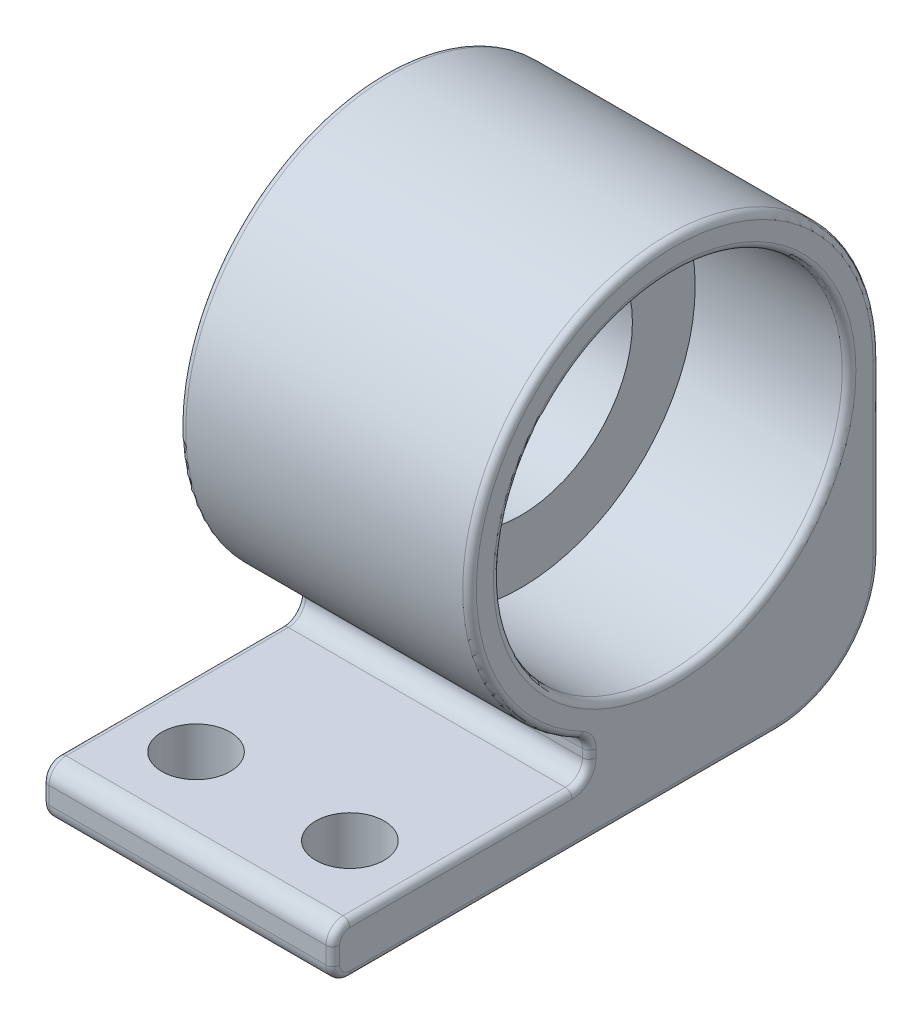
ISO-10303-21;
HEADER;
FILE_DESCRIPTION(('STEP AP214'),'2;1');
FILE_NAME('part.step','',(''),(''),'','','');
FILE_SCHEMA(('AUTOMOTIVE_DESIGN { 1 0 10303 214 1 1 1 1 }'));
ENDSEC;
DATA;
#1=APPLICATION_CONTEXT('core data for automotive mechanical design processes');
#2=APPLICATION_PROTOCOL_DEFINITION('international standard','automotive_design',2000,#1);
#3=PRODUCT_CONTEXT('',#1,'mechanical');
#4=PRODUCT('Part','Part','',(#3));
#5=PRODUCT_RELATED_PRODUCT_CATEGORY('part','',(#4));
#6=PRODUCT_DEFINITION_FORMATION('','',#4);
#7=PRODUCT_DEFINITION_CONTEXT('part definition',#1,'design');
#8=PRODUCT_DEFINITION('design','',#6,#7);
#9=PRODUCT_DEFINITION_SHAPE('','',#8);
#10=(LENGTH_UNIT() NAMED_UNIT(*) SI_UNIT(.MILLI.,.METRE.));
#11=(NAMED_UNIT(*) PLANE_ANGLE_UNIT() SI_UNIT($,.RADIAN.));
#12=(NAMED_UNIT(*) SI_UNIT($,.STERADIAN.) SOLID_ANGLE_UNIT());
#13=UNCERTAINTY_MEASURE_WITH_UNIT(LENGTH_MEASURE(1.E-05),#10,'distance_accuracy_value','');
#14=(GEOMETRIC_REPRESENTATION_CONTEXT(3) GLOBAL_UNCERTAINTY_ASSIGNED_CONTEXT((#13)) GLOBAL_UNIT_ASSIGNED_CONTEXT((#10,
#11,#12)) REPRESENTATION_CONTEXT('',''));
#15=CARTESIAN_POINT('',(0.,0.,0.));
#16=DIRECTION('',(0.,0.,1.));
#17=DIRECTION('',(1.,0.,0.));
#18=AXIS2_PLACEMENT_3D('',#15,#16,#17);
#19=CARTESIAN_POINT('',(8.5,0.,0.));
#20=DIRECTION('',(-1.,0.,0.));
#21=DIRECTION('',(0.,0.,1.));
#22=AXIS2_PLACEMENT_3D('',#19,#20,#21);
#23=CYLINDRICAL_SURFACE('',#22,6.);
#24=DIRECTION('',(-1.,0.,0.));
#25=VECTOR('',#24,1.);
#26=CARTESIAN_POINT('',(8.5,0.,-6.));
#27=LINE('',#26,#25);
#28=CARTESIAN_POINT('',(8.3,0.,-6.));
#29=VERTEX_POINT('',#28);
#30=CARTESIAN_POINT('',(0.200000000000001,0.,-6.));
#31=VERTEX_POINT('',#30);
#32=EDGE_CURVE('E418',#29,#31,#27,.T.);
#33=ORIENTED_EDGE('',*,*,#32,.T.);
#34=CARTESIAN_POINT('',(0.200000000000001,0.,0.));
#35=DIRECTION('',(1.,0.,0.));
#36=DIRECTION('',(0.,0.,-1.));
#37=AXIS2_PLACEMENT_3D('',#34,#35,#36);
#38=CIRCLE('',#37,6.);
#39=CARTESIAN_POINT('',(0.200000000000001,-5.32272119754037,2.76923076923077));
#40=VERTEX_POINT('',#39);
#41=EDGE_CURVE('E294',#31,#40,#38,.T.);
#42=ORIENTED_EDGE('',*,*,#41,.T.);
#43=DIRECTION('',(-1.,0.,0.));
#44=VECTOR('',#43,1.);
#45=CARTESIAN_POINT('',(8.5,-5.32272119754037,2.76923076923077));
#46=LINE('',#45,#44);
#47=CARTESIAN_POINT('',(8.3,-5.32272119754037,2.76923076923077));
#48=VERTEX_POINT('',#47);
#49=EDGE_CURVE('E210',#48,#40,#46,.T.);
#50=ORIENTED_EDGE('',*,*,#49,.F.);
#51=CARTESIAN_POINT('',(8.3,0.,0.));
#52=DIRECTION('',(1.,0.,0.));
#53=DIRECTION('',(0.,0.,-1.));
#54=AXIS2_PLACEMENT_3D('',#51,#52,#53);
#55=CIRCLE('',#54,6.);
#56=EDGE_CURVE('E292',#48,#29,#55,.F.);
#57=ORIENTED_EDGE('',*,*,#56,.T.);
#58=EDGE_LOOP('',(#33,#42,#50,#57));
#59=FACE_BOUND('',#58,.T.);
#60=ADVANCED_FACE('F36',(#59),#23,.T.);
#61=CARTESIAN_POINT('',(8.5,-5.7662812973354,3.));
#62=DIRECTION('',(-1.,0.,0.));
#63=DIRECTION('',(0.,0.,1.));
#64=AXIS2_PLACEMENT_3D('',#61,#62,#63);
#65=CYLINDRICAL_SURFACE('',#64,0.5);
#66=ORIENTED_EDGE('',*,*,#49,.T.);
#67=CARTESIAN_POINT('',(0.200000000000001,-5.7662812973354,3.));
#68=DIRECTION('',(1.,0.,0.));
#69=DIRECTION('',(0.,0.,-1.));
#70=AXIS2_PLACEMENT_3D('',#67,#68,#69);
#71=CIRCLE('',#70,0.5);
#72=CARTESIAN_POINT('',(0.200000000000001,-5.7662812973354,2.5));
#73=VERTEX_POINT('',#72);
#74=EDGE_CURVE('E209',#40,#73,#71,.F.);
#75=ORIENTED_EDGE('',*,*,#74,.T.);
#76=DIRECTION('',(-1.,0.,0.));
#77=VECTOR('',#76,1.);
#78=CARTESIAN_POINT('',(8.5,-5.7662812973354,2.5));
#79=LINE('',#78,#77);
#80=CARTESIAN_POINT('',(8.3,-5.7662812973354,2.5));
#81=VERTEX_POINT('',#80);
#82=EDGE_CURVE('E191',#81,#73,#79,.T.);
#83=ORIENTED_EDGE('',*,*,#82,.F.);
#84=CARTESIAN_POINT('',(8.3,-5.7662812973354,3.));
#85=DIRECTION('',(1.,0.,0.));
#86=DIRECTION('',(0.,0.,-1.));
#87=AXIS2_PLACEMENT_3D('',#84,#85,#86);
#88=CIRCLE('',#87,0.5);
#89=EDGE_CURVE('E206',#81,#48,#88,.T.);
#90=ORIENTED_EDGE('',*,*,#89,.T.);
#91=EDGE_LOOP('',(#66,#75,#83,#90));
#92=FACE_BOUND('',#91,.T.);
#93=ADVANCED_FACE('F204',(#92),#65,.F.);
#94=CARTESIAN_POINT('',(8.5,-5.7662812973354,2.5));
#95=DIRECTION('',(0.,0.,-1.));
#96=DIRECTION('',(-1.,0.,0.));
#97=AXIS2_PLACEMENT_3D('',#94,#95,#96);
#98=PLANE('',#97);
#99=ORIENTED_EDGE('',*,*,#82,.T.);
#100=DIRECTION('',(0.,-1.,0.));
#101=VECTOR('',#100,1.);
#102=CARTESIAN_POINT('',(0.200000000000001,-5.7662812973354,2.5));
#103=LINE('',#102,#101);
#104=CARTESIAN_POINT('',(0.200000000000001,-5.99999999999999,2.5));
#105=VERTEX_POINT('',#104);
#106=EDGE_CURVE('E198',#73,#105,#103,.T.);
#107=ORIENTED_EDGE('',*,*,#106,.T.);
#108=DIRECTION('',(-1.,0.,0.));
#109=VECTOR('',#108,1.);
#110=CARTESIAN_POINT('',(8.5,-5.99999999999999,2.5));
#111=LINE('',#110,#109);
#112=CARTESIAN_POINT('',(8.3,-5.99999999999999,2.5));
#113=VERTEX_POINT('',#112);
#114=EDGE_CURVE('E193',#113,#105,#111,.T.);
#115=ORIENTED_EDGE('',*,*,#114,.F.);
#116=DIRECTION('',(0.,-1.,0.));
#117=VECTOR('',#116,1.);
#118=CARTESIAN_POINT('',(8.3,-5.7662812973354,2.5));
#119=LINE('',#118,#117);
#120=EDGE_CURVE('E188',#113,#81,#119,.F.);
#121=ORIENTED_EDGE('',*,*,#120,.T.);
#122=EDGE_LOOP('',(#99,#107,#115,#121));
#123=FACE_BOUND('',#122,.T.);
#124=ADVANCED_FACE('F190',(#123),#98,.F.);
#125=CARTESIAN_POINT('',(8.5,-6.,3.));
#126=DIRECTION('',(-1.,0.,0.));
#127=DIRECTION('',(0.,0.,1.));
#128=AXIS2_PLACEMENT_3D('',#125,#126,#127);
#129=CYLINDRICAL_SURFACE('',#128,0.5);
#130=ORIENTED_EDGE('',*,*,#114,.T.);
#131=CARTESIAN_POINT('',(0.200000000000001,-6.,3.));
#132=DIRECTION('',(1.,0.,0.));
#133=DIRECTION('',(0.,0.,-1.));
#134=AXIS2_PLACEMENT_3D('',#131,#132,#133);
#135=CIRCLE('',#134,0.5);
#136=CARTESIAN_POINT('',(0.200000000000001,-6.5,3.));
#137=VERTEX_POINT('',#136);
#138=EDGE_CURVE('E261',#105,#137,#135,.F.);
#139=ORIENTED_EDGE('',*,*,#138,.T.);
#140=DIRECTION('',(-1.,0.,0.));
#141=VECTOR('',#140,1.);
#142=CARTESIAN_POINT('',(8.5,-6.5,3.));
#143=LINE('',#142,#141);
#144=CARTESIAN_POINT('',(8.3,-6.5,3.));
#145=VERTEX_POINT('',#144);
#146=EDGE_CURVE('E394',#145,#137,#143,.T.);
#147=ORIENTED_EDGE('',*,*,#146,.F.);
#148=CARTESIAN_POINT('',(8.3,-6.,3.));
#149=DIRECTION('',(1.,0.,0.));
#150=DIRECTION('',(0.,0.,-1.));
#151=AXIS2_PLACEMENT_3D('',#148,#149,#150);
#152=CIRCLE('',#151,0.5);
#153=EDGE_CURVE('E259',#145,#113,#152,.T.);
#154=ORIENTED_EDGE('',*,*,#153,.T.);
#155=EDGE_LOOP('',(#130,#139,#147,#154));
#156=FACE_BOUND('',#155,.T.);
#157=ADVANCED_FACE('F391',(#156),#129,.F.);
#158=CARTESIAN_POINT('',(8.5,-6.5,9.5));
#159=DIRECTION('',(0.,-1.,0.));
#160=DIRECTION('',(0.,0.,-1.));
#161=AXIS2_PLACEMENT_3D('',#158,#159,#160);
#162=PLANE('',#161);
#163=CARTESIAN_POINT('',(6.5,-6.5,7.5));
#164=DIRECTION('',(0.,1.,0.));
#165=DIRECTION('',(0.,0.,1.));
#166=AXIS2_PLACEMENT_3D('',#163,#164,#165);
#167=CIRCLE('',#166,1.);
#168=CARTESIAN_POINT('',(6.5,-6.5,8.5));
#169=VERTEX_POINT('',#168);
#170=EDGE_CURVE('E348',#169,#169,#167,.T.);
#171=ORIENTED_EDGE('',*,*,#170,.F.);
#172=EDGE_LOOP('',(#171));
#173=FACE_BOUND('',#172,.T.);
#174=CARTESIAN_POINT('',(2.,-6.5,7.5));
#175=DIRECTION('',(0.,1.,0.));
#176=DIRECTION('',(0.,0.,1.));
#177=AXIS2_PLACEMENT_3D('',#174,#175,#176);
#178=CIRCLE('',#177,1.);
#179=CARTESIAN_POINT('',(2.,-6.5,8.5));
#180=VERTEX_POINT('',#179);
#181=EDGE_CURVE('E433',#180,#180,#178,.T.);
#182=ORIENTED_EDGE('',*,*,#181,.F.);
#183=EDGE_LOOP('',(#182));
#184=FACE_BOUND('',#183,.T.);
#185=ORIENTED_EDGE('',*,*,#146,.T.);
#186=DIRECTION('',(0.,0.,1.));
#187=VECTOR('',#186,1.);
#188=CARTESIAN_POINT('',(0.200000000000001,-6.5,9.5));
#189=LINE('',#188,#187);
#190=CARTESIAN_POINT('',(0.200000000000001,-6.5,9.5));
#191=VERTEX_POINT('',#190);
#192=EDGE_CURVE('E265',#137,#191,#189,.T.);
#193=ORIENTED_EDGE('',*,*,#192,.T.);
#194=DIRECTION('',(-1.,0.,0.));
#195=VECTOR('',#194,1.);
#196=CARTESIAN_POINT('',(8.5,-6.5,9.5));
#197=LINE('',#196,#195);
#198=CARTESIAN_POINT('',(8.3,-6.5,9.5));
#199=VERTEX_POINT('',#198);
#200=EDGE_CURVE('E397',#199,#191,#197,.T.);
#201=ORIENTED_EDGE('',*,*,#200,.F.);
#202=DIRECTION('',(0.,0.,1.));
#203=VECTOR('',#202,1.);
#204=CARTESIAN_POINT('',(8.3,-6.5,3.));
#205=LINE('',#204,#203);
#206=EDGE_CURVE('E263',#199,#145,#205,.F.);
#207=ORIENTED_EDGE('',*,*,#206,.T.);
#208=EDGE_LOOP('',(#185,#193,#201,#207));
#209=FACE_BOUND('',#208,.T.);
#210=ADVANCED_FACE('F445',(#173,#184,#209),#162,.F.);
#211=CARTESIAN_POINT('',(8.5,-7.,9.5));
#212=DIRECTION('',(-1.,0.,0.));
#213=DIRECTION('',(0.,0.,1.));
#214=AXIS2_PLACEMENT_3D('',#211,#212,#213);
#215=CYLINDRICAL_SURFACE('',#214,0.5);
#216=ORIENTED_EDGE('',*,*,#200,.T.);
#217=CARTESIAN_POINT('',(0.200000000000001,-7.,9.5));
#218=DIRECTION('',(1.,0.,0.));
#219=DIRECTION('',(0.,0.,-1.));
#220=AXIS2_PLACEMENT_3D('',#217,#218,#219);
#221=CIRCLE('',#220,0.5);
#222=CARTESIAN_POINT('',(0.200000000000001,-7.,10.));
#223=VERTEX_POINT('',#222);
#224=EDGE_CURVE('E269',#191,#223,#221,.T.);
#225=ORIENTED_EDGE('',*,*,#224,.T.);
#226=DIRECTION('',(-1.,0.,0.));
#227=VECTOR('',#226,1.);
#228=CARTESIAN_POINT('',(8.5,-7.,10.));
#229=LINE('',#228,#227);
#230=CARTESIAN_POINT('',(8.3,-7.,10.));
#231=VERTEX_POINT('',#230);
#232=EDGE_CURVE('E401',#231,#223,#229,.T.);
#233=ORIENTED_EDGE('',*,*,#232,.F.);
#234=CARTESIAN_POINT('',(8.3,-7.,9.5));
#235=DIRECTION('',(1.,0.,0.));
#236=DIRECTION('',(0.,0.,-1.));
#237=AXIS2_PLACEMENT_3D('',#234,#235,#236);
#238=CIRCLE('',#237,0.5);
#239=EDGE_CURVE('E267',#231,#199,#238,.F.);
#240=ORIENTED_EDGE('',*,*,#239,.T.);
#241=EDGE_LOOP('',(#216,#225,#233,#240));
#242=FACE_BOUND('',#241,.T.);
#243=ADVANCED_FACE('F448',(#242),#215,.T.);
#244=CARTESIAN_POINT('',(8.5,-7.,10.));
#245=DIRECTION('',(0.,0.,-1.));
#246=DIRECTION('',(-1.,0.,0.));
#247=AXIS2_PLACEMENT_3D('',#244,#245,#246);
#248=PLANE('',#247);
#249=ORIENTED_EDGE('',*,*,#232,.T.);
#250=DIRECTION('',(0.,-1.,0.));
#251=VECTOR('',#250,1.);
#252=CARTESIAN_POINT('',(0.200000000000001,-7.,10.));
#253=LINE('',#252,#251);
#254=CARTESIAN_POINT('',(0.200000000000001,-7.5,10.));
#255=VERTEX_POINT('',#254);
#256=EDGE_CURVE('E273',#223,#255,#253,.T.);
#257=ORIENTED_EDGE('',*,*,#256,.T.);
#258=DIRECTION('',(-1.,0.,0.));
#259=VECTOR('',#258,1.);
#260=CARTESIAN_POINT('',(8.5,-7.5,10.));
#261=LINE('',#260,#259);
#262=CARTESIAN_POINT('',(8.3,-7.5,10.));
#263=VERTEX_POINT('',#262);
#264=EDGE_CURVE('E406',#263,#255,#261,.T.);
#265=ORIENTED_EDGE('',*,*,#264,.F.);
#266=DIRECTION('',(0.,-1.,0.));
#267=VECTOR('',#266,1.);
#268=CARTESIAN_POINT('',(8.3,-7.,10.));
#269=LINE('',#268,#267);
#270=EDGE_CURVE('E271',#263,#231,#269,.F.);
#271=ORIENTED_EDGE('',*,*,#270,.T.);
#272=EDGE_LOOP('',(#249,#257,#265,#271));
#273=FACE_BOUND('',#272,.T.);
#274=ADVANCED_FACE('F540',(#273),#248,.F.);
#275=CARTESIAN_POINT('',(8.5,-7.5,9.5));
#276=DIRECTION('',(-1.,0.,0.));
#277=DIRECTION('',(0.,0.,1.));
#278=AXIS2_PLACEMENT_3D('',#275,#276,#277);
#279=CYLINDRICAL_SURFACE('',#278,0.5);
#280=ORIENTED_EDGE('',*,*,#264,.T.);
#281=CARTESIAN_POINT('',(0.200000000000001,-7.5,9.5));
#282=DIRECTION('',(1.,0.,0.));
#283=DIRECTION('',(0.,0.,-1.));
#284=AXIS2_PLACEMENT_3D('',#281,#282,#283);
#285=CIRCLE('',#284,0.5);
#286=CARTESIAN_POINT('',(0.200000000000001,-8.,9.5));
#287=VERTEX_POINT('',#286);
#288=EDGE_CURVE('E277',#255,#287,#285,.T.);
#289=ORIENTED_EDGE('',*,*,#288,.T.);
#290=DIRECTION('',(-1.,0.,0.));
#291=VECTOR('',#290,1.);
#292=CARTESIAN_POINT('',(8.5,-8.,9.5));
#293=LINE('',#292,#291);
#294=CARTESIAN_POINT('',(8.3,-8.,9.5));
#295=VERTEX_POINT('',#294);
#296=EDGE_CURVE('E409',#295,#287,#293,.T.);
#297=ORIENTED_EDGE('',*,*,#296,.F.);
#298=CARTESIAN_POINT('',(8.3,-7.5,9.5));
#299=DIRECTION('',(1.,0.,0.));
#300=DIRECTION('',(0.,0.,-1.));
#301=AXIS2_PLACEMENT_3D('',#298,#299,#300);
#302=CIRCLE('',#301,0.5);
#303=EDGE_CURVE('E275',#295,#263,#302,.F.);
#304=ORIENTED_EDGE('',*,*,#303,.T.);
#305=EDGE_LOOP('',(#280,#289,#297,#304));
#306=FACE_BOUND('',#305,.T.);
#307=ADVANCED_FACE('F463',(#306),#279,.T.);
#308=CARTESIAN_POINT('',(8.5,-8.,9.5));
#309=DIRECTION('',(0.,1.,0.));
#310=DIRECTION('',(0.,0.,1.));
#311=AXIS2_PLACEMENT_3D('',#308,#309,#310);
#312=PLANE('',#311);
#313=CARTESIAN_POINT('',(6.5,-8.,7.5));
#314=DIRECTION('',(0.,1.,0.));
#315=DIRECTION('',(0.,0.,1.));
#316=AXIS2_PLACEMENT_3D('',#313,#314,#315);
#317=CIRCLE('',#316,1.);
#318=CARTESIAN_POINT('',(6.5,-8.,8.5));
#319=VERTEX_POINT('',#318);
#320=EDGE_CURVE('E436',#319,#319,#317,.F.);
#321=ORIENTED_EDGE('',*,*,#320,.F.);
#322=EDGE_LOOP('',(#321));
#323=FACE_BOUND('',#322,.T.);
#324=CARTESIAN_POINT('',(2.,-8.,7.5));
#325=DIRECTION('',(0.,1.,0.));
#326=DIRECTION('',(0.,0.,1.));
#327=AXIS2_PLACEMENT_3D('',#324,#325,#326);
#328=CIRCLE('',#327,1.);
#329=CARTESIAN_POINT('',(2.,-8.,8.5));
#330=VERTEX_POINT('',#329);
#331=EDGE_CURVE('E430',#330,#330,#328,.F.);
#332=ORIENTED_EDGE('',*,*,#331,.F.);
#333=EDGE_LOOP('',(#332));
#334=FACE_BOUND('',#333,.T.);
#335=ORIENTED_EDGE('',*,*,#296,.T.);
#336=DIRECTION('',(0.,0.,-1.));
#337=VECTOR('',#336,1.);
#338=CARTESIAN_POINT('',(0.200000000000001,-8.,9.5));
#339=LINE('',#338,#337);
#340=CARTESIAN_POINT('',(0.200000000000001,-8.,-3.));
#341=VERTEX_POINT('',#340);
#342=EDGE_CURVE('E281',#287,#341,#339,.T.);
#343=ORIENTED_EDGE('',*,*,#342,.T.);
#344=DIRECTION('',(-1.,0.,0.));
#345=VECTOR('',#344,1.);
#346=CARTESIAN_POINT('',(8.5,-8.,-3.));
#347=LINE('',#346,#345);
#348=CARTESIAN_POINT('',(8.3,-8.,-3.));
#349=VERTEX_POINT('',#348);
#350=EDGE_CURVE('E412',#349,#341,#347,.T.);
#351=ORIENTED_EDGE('',*,*,#350,.F.);
#352=DIRECTION('',(0.,0.,-1.));
#353=VECTOR('',#352,1.);
#354=CARTESIAN_POINT('',(8.3,-8.,9.5));
#355=LINE('',#354,#353);
#356=EDGE_CURVE('E279',#349,#295,#355,.F.);
#357=ORIENTED_EDGE('',*,*,#356,.T.);
#358=EDGE_LOOP('',(#335,#343,#351,#357));
#359=FACE_BOUND('',#358,.T.);
#360=ADVANCED_FACE('F459',(#323,#334,#359),#312,.F.);
#361=CARTESIAN_POINT('',(8.5,-5.,-3.));
#362=DIRECTION('',(-1.,0.,0.));
#363=DIRECTION('',(0.,0.,1.));
#364=AXIS2_PLACEMENT_3D('',#361,#362,#363);
#365=CYLINDRICAL_SURFACE('',#364,3.);
#366=ORIENTED_EDGE('',*,*,#350,.T.);
#367=CARTESIAN_POINT('',(0.200000000000001,-5.,-3.));
#368=DIRECTION('',(1.,0.,0.));
#369=DIRECTION('',(0.,0.,-1.));
#370=AXIS2_PLACEMENT_3D('',#367,#368,#369);
#371=CIRCLE('',#370,3.);
#372=CARTESIAN_POINT('',(0.200000000000001,-5.,-6.));
#373=VERTEX_POINT('',#372);
#374=EDGE_CURVE('E285',#341,#373,#371,.T.);
#375=ORIENTED_EDGE('',*,*,#374,.T.);
#376=DIRECTION('',(-1.,0.,0.));
#377=VECTOR('',#376,1.);
#378=CARTESIAN_POINT('',(8.5,-5.,-6.));
#379=LINE('',#378,#377);
#380=CARTESIAN_POINT('',(8.3,-5.,-6.));
#381=VERTEX_POINT('',#380);
#382=EDGE_CURVE('E415',#381,#373,#379,.T.);
#383=ORIENTED_EDGE('',*,*,#382,.F.);
#384=CARTESIAN_POINT('',(8.3,-5.,-3.));
#385=DIRECTION('',(1.,0.,0.));
#386=DIRECTION('',(0.,0.,-1.));
#387=AXIS2_PLACEMENT_3D('',#384,#385,#386);
#388=CIRCLE('',#387,3.);
#389=EDGE_CURVE('E283',#381,#349,#388,.F.);
#390=ORIENTED_EDGE('',*,*,#389,.T.);
#391=EDGE_LOOP('',(#366,#375,#383,#390));
#392=FACE_BOUND('',#391,.T.);
#393=ADVANCED_FACE('F462',(#392),#365,.T.);
#394=CARTESIAN_POINT('',(8.5,0.,-6.));
#395=DIRECTION('',(0.,0.,1.));
#396=DIRECTION('',(0.,-1.,0.));
#397=AXIS2_PLACEMENT_3D('',#394,#395,#396);
#398=PLANE('',#397);
#399=ORIENTED_EDGE('',*,*,#382,.T.);
#400=DIRECTION('',(0.,1.,0.));
#401=VECTOR('',#400,1.);
#402=CARTESIAN_POINT('',(0.200000000000001,0.,-6.));
#403=LINE('',#402,#401);
#404=EDGE_CURVE('E290',#373,#31,#403,.T.);
#405=ORIENTED_EDGE('',*,*,#404,.T.);
#406=ORIENTED_EDGE('',*,*,#32,.F.);
#407=DIRECTION('',(0.,1.,0.));
#408=VECTOR('',#407,1.);
#409=CARTESIAN_POINT('',(8.3,-5.,-6.));
#410=LINE('',#409,#408);
#411=EDGE_CURVE('E287',#29,#381,#410,.F.);
#412=ORIENTED_EDGE('',*,*,#411,.T.);
#413=EDGE_LOOP('',(#399,#405,#406,#412));
#414=FACE_BOUND('',#413,.T.);
#415=ADVANCED_FACE('F491',(#414),#398,.F.);
#416=CARTESIAN_POINT('',(8.5,0.,0.));
#417=DIRECTION('',(1.,0.,0.));
#418=DIRECTION('',(0.,0.,-1.));
#419=AXIS2_PLACEMENT_3D('',#416,#417,#418);
#420=PLANE('',#419);
#421=CARTESIAN_POINT('',(8.5,-5.,-3.));
#422=DIRECTION('',(1.,0.,0.));
#423=DIRECTION('',(0.,0.,-1.));
#424=AXIS2_PLACEMENT_3D('',#421,#422,#423);
#425=CIRCLE('',#424,2.8);
#426=CARTESIAN_POINT('',(8.5,-7.8,-3.));
#427=VERTEX_POINT('',#426);
#428=CARTESIAN_POINT('',(8.5,-5.,-5.8));
#429=VERTEX_POINT('',#428);
#430=EDGE_CURVE('E53',#427,#429,#425,.T.);
#431=ORIENTED_EDGE('',*,*,#430,.T.);
#432=DIRECTION('',(0.,1.,0.));
#433=VECTOR('',#432,1.);
#434=CARTESIAN_POINT('',(8.5,0.,-5.8));
#435=LINE('',#434,#433);
#436=CARTESIAN_POINT('',(8.5,0.,-5.8));
#437=VERTEX_POINT('',#436);
#438=EDGE_CURVE('E45',#429,#437,#435,.T.);
#439=ORIENTED_EDGE('',*,*,#438,.T.);
#440=CARTESIAN_POINT('',(8.5,0.,0.));
#441=DIRECTION('',(1.,0.,0.));
#442=DIRECTION('',(0.,0.,-1.));
#443=AXIS2_PLACEMENT_3D('',#440,#441,#442);
#444=CIRCLE('',#443,5.8);
#445=CARTESIAN_POINT('',(8.5,-5.14529715762236,2.67692307692308));
#446=VERTEX_POINT('',#445);
#447=EDGE_CURVE('E299',#437,#446,#444,.T.);
#448=ORIENTED_EDGE('',*,*,#447,.T.);
#449=CARTESIAN_POINT('',(8.5,-5.7662812973354,3.));
#450=DIRECTION('',(1.,0.,0.));
#451=DIRECTION('',(0.,0.,-1.));
#452=AXIS2_PLACEMENT_3D('',#449,#450,#451);
#453=CIRCLE('',#452,0.7);
#454=CARTESIAN_POINT('',(8.5,-5.7662812973354,2.3));
#455=VERTEX_POINT('',#454);
#456=EDGE_CURVE('E301',#446,#455,#453,.F.);
#457=ORIENTED_EDGE('',*,*,#456,.T.);
#458=DIRECTION('',(0.,-1.,0.));
#459=VECTOR('',#458,1.);
#460=CARTESIAN_POINT('',(8.5,-5.99999999999999,2.3));
#461=LINE('',#460,#459);
#462=CARTESIAN_POINT('',(8.5,-5.99999999999999,2.3));
#463=VERTEX_POINT('',#462);
#464=EDGE_CURVE('E216',#455,#463,#461,.T.);
#465=ORIENTED_EDGE('',*,*,#464,.T.);
#466=CARTESIAN_POINT('',(8.5,-6.,3.));
#467=DIRECTION('',(1.,0.,0.));
#468=DIRECTION('',(0.,0.,-1.));
#469=AXIS2_PLACEMENT_3D('',#466,#467,#468);
#470=CIRCLE('',#469,0.7);
#471=CARTESIAN_POINT('',(8.5,-6.7,3.));
#472=VERTEX_POINT('',#471);
#473=EDGE_CURVE('E304',#463,#472,#470,.F.);
#474=ORIENTED_EDGE('',*,*,#473,.T.);
#475=DIRECTION('',(0.,0.,1.));
#476=VECTOR('',#475,1.);
#477=CARTESIAN_POINT('',(8.5,-6.7,9.5));
#478=LINE('',#477,#476);
#479=CARTESIAN_POINT('',(8.5,-6.7,9.5));
#480=VERTEX_POINT('',#479);
#481=EDGE_CURVE('E306',#472,#480,#478,.T.);
#482=ORIENTED_EDGE('',*,*,#481,.T.);
#483=CARTESIAN_POINT('',(8.5,-7.,9.5));
#484=DIRECTION('',(1.,0.,0.));
#485=DIRECTION('',(0.,0.,-1.));
#486=AXIS2_PLACEMENT_3D('',#483,#484,#485);
#487=CIRCLE('',#486,0.3);
#488=CARTESIAN_POINT('',(8.5,-7.,9.8));
#489=VERTEX_POINT('',#488);
#490=EDGE_CURVE('E308',#480,#489,#487,.T.);
#491=ORIENTED_EDGE('',*,*,#490,.T.);
#492=DIRECTION('',(0.,-1.,0.));
#493=VECTOR('',#492,1.);
#494=CARTESIAN_POINT('',(8.5,-7.5,9.8));
#495=LINE('',#494,#493);
#496=CARTESIAN_POINT('',(8.5,-7.5,9.8));
#497=VERTEX_POINT('',#496);
#498=EDGE_CURVE('E310',#489,#497,#495,.T.);
#499=ORIENTED_EDGE('',*,*,#498,.T.);
#500=CARTESIAN_POINT('',(8.5,-7.5,9.5));
#501=DIRECTION('',(1.,0.,0.));
#502=DIRECTION('',(0.,0.,-1.));
#503=AXIS2_PLACEMENT_3D('',#500,#501,#502);
#504=CIRCLE('',#503,0.3);
#505=CARTESIAN_POINT('',(8.5,-7.8,9.5));
#506=VERTEX_POINT('',#505);
#507=EDGE_CURVE('E312',#497,#506,#504,.T.);
#508=ORIENTED_EDGE('',*,*,#507,.T.);
#509=DIRECTION('',(0.,0.,-1.));
#510=VECTOR('',#509,1.);
#511=CARTESIAN_POINT('',(8.5,-7.8,-3.));
#512=LINE('',#511,#510);
#513=EDGE_CURVE('E58',#506,#427,#512,.T.);
#514=ORIENTED_EDGE('',*,*,#513,.T.);
#515=EDGE_LOOP('',(#431,#439,#448,#457,#465,#474,#482,#491,#499,#508,#514));
#516=FACE_BOUND('',#515,.T.);
#517=CARTESIAN_POINT('',(8.5,0.,0.));
#518=DIRECTION('',(1.,0.,0.));
#519=DIRECTION('',(0.,0.,-1.));
#520=AXIS2_PLACEMENT_3D('',#517,#518,#519);
#521=CIRCLE('',#520,5.3);
#522=CARTESIAN_POINT('',(8.5,0.,-5.3));
#523=VERTEX_POINT('',#522);
#524=EDGE_CURVE('E296',#523,#523,#521,.F.);
#525=ORIENTED_EDGE('',*,*,#524,.T.);
#526=EDGE_LOOP('',(#525));
#527=FACE_BOUND('',#526,.T.);
#528=ADVANCED_FACE('F382',(#516,#527),#420,.T.);
#529=CARTESIAN_POINT('',(0.,0.,0.));
#530=DIRECTION('',(1.,0.,0.));
#531=DIRECTION('',(0.,0.,-1.));
#532=AXIS2_PLACEMENT_3D('',#529,#530,#531);
#533=PLANE('',#532);
#534=DIRECTION('',(0.,-1.,0.));
#535=VECTOR('',#534,1.);
#536=CARTESIAN_POINT('',(0.,0.,2.3));
#537=LINE('',#536,#535);
#538=CARTESIAN_POINT('',(0.,-5.99999999999999,2.3));
#539=VERTEX_POINT('',#538);
#540=CARTESIAN_POINT('',(0.,-5.7662812973354,2.3));
#541=VERTEX_POINT('',#540);
#542=EDGE_CURVE('E254',#539,#541,#537,.F.);
#543=ORIENTED_EDGE('',*,*,#542,.T.);
#544=CARTESIAN_POINT('',(0.,-5.7662812973354,3.));
#545=DIRECTION('',(1.,0.,0.));
#546=DIRECTION('',(0.,0.,-1.));
#547=AXIS2_PLACEMENT_3D('',#544,#545,#546);
#548=CIRCLE('',#547,0.7);
#549=CARTESIAN_POINT('',(0.,-5.14529715762236,2.67692307692308));
#550=VERTEX_POINT('',#549);
#551=EDGE_CURVE('E199',#541,#550,#548,.T.);
#552=ORIENTED_EDGE('',*,*,#551,.T.);
#553=CARTESIAN_POINT('',(0.,0.,0.));
#554=DIRECTION('',(1.,0.,0.));
#555=DIRECTION('',(0.,0.,-1.));
#556=AXIS2_PLACEMENT_3D('',#553,#554,#555);
#557=CIRCLE('',#556,5.8);
#558=CARTESIAN_POINT('',(0.,0.,-5.8));
#559=VERTEX_POINT('',#558);
#560=EDGE_CURVE('E236',#550,#559,#557,.F.);
#561=ORIENTED_EDGE('',*,*,#560,.T.);
#562=DIRECTION('',(0.,1.,0.));
#563=VECTOR('',#562,1.);
#564=CARTESIAN_POINT('',(0.,0.,-5.8));
#565=LINE('',#564,#563);
#566=CARTESIAN_POINT('',(0.,-5.,-5.8));
#567=VERTEX_POINT('',#566);
#568=EDGE_CURVE('E238',#559,#567,#565,.F.);
#569=ORIENTED_EDGE('',*,*,#568,.T.);
#570=CARTESIAN_POINT('',(0.,-5.,-3.));
#571=DIRECTION('',(1.,0.,0.));
#572=DIRECTION('',(0.,0.,-1.));
#573=AXIS2_PLACEMENT_3D('',#570,#571,#572);
#574=CIRCLE('',#573,2.8);
#575=CARTESIAN_POINT('',(0.,-7.8,-3.));
#576=VERTEX_POINT('',#575);
#577=EDGE_CURVE('E240',#567,#576,#574,.F.);
#578=ORIENTED_EDGE('',*,*,#577,.T.);
#579=DIRECTION('',(0.,0.,-1.));
#580=VECTOR('',#579,1.);
#581=CARTESIAN_POINT('',(0.,-7.8,0.));
#582=LINE('',#581,#580);
#583=CARTESIAN_POINT('',(0.,-7.8,9.5));
#584=VERTEX_POINT('',#583);
#585=EDGE_CURVE('E242',#576,#584,#582,.F.);
#586=ORIENTED_EDGE('',*,*,#585,.T.);
#587=CARTESIAN_POINT('',(0.,-7.5,9.5));
#588=DIRECTION('',(1.,0.,0.));
#589=DIRECTION('',(0.,0.,-1.));
#590=AXIS2_PLACEMENT_3D('',#587,#588,#589);
#591=CIRCLE('',#590,0.3);
#592=CARTESIAN_POINT('',(0.,-7.5,9.8));
#593=VERTEX_POINT('',#592);
#594=EDGE_CURVE('E244',#584,#593,#591,.F.);
#595=ORIENTED_EDGE('',*,*,#594,.T.);
#596=DIRECTION('',(0.,-1.,0.));
#597=VECTOR('',#596,1.);
#598=CARTESIAN_POINT('',(0.,0.,9.8));
#599=LINE('',#598,#597);
#600=CARTESIAN_POINT('',(0.,-7.,9.8));
#601=VERTEX_POINT('',#600);
#602=EDGE_CURVE('E246',#593,#601,#599,.F.);
#603=ORIENTED_EDGE('',*,*,#602,.T.);
#604=CARTESIAN_POINT('',(0.,-7.,9.5));
#605=DIRECTION('',(1.,0.,0.));
#606=DIRECTION('',(0.,0.,-1.));
#607=AXIS2_PLACEMENT_3D('',#604,#605,#606);
#608=CIRCLE('',#607,0.3);
#609=CARTESIAN_POINT('',(0.,-6.7,9.5));
#610=VERTEX_POINT('',#609);
#611=EDGE_CURVE('E248',#601,#610,#608,.F.);
#612=ORIENTED_EDGE('',*,*,#611,.T.);
#613=DIRECTION('',(0.,0.,1.));
#614=VECTOR('',#613,1.);
#615=CARTESIAN_POINT('',(0.,-6.7,0.));
#616=LINE('',#615,#614);
#617=CARTESIAN_POINT('',(0.,-6.7,3.));
#618=VERTEX_POINT('',#617);
#619=EDGE_CURVE('E250',#610,#618,#616,.F.);
#620=ORIENTED_EDGE('',*,*,#619,.T.);
#621=CARTESIAN_POINT('',(0.,-6.,3.));
#622=DIRECTION('',(1.,0.,0.));
#623=DIRECTION('',(0.,0.,-1.));
#624=AXIS2_PLACEMENT_3D('',#621,#622,#623);
#625=CIRCLE('',#624,0.7);
#626=EDGE_CURVE('E252',#618,#539,#625,.T.);
#627=ORIENTED_EDGE('',*,*,#626,.T.);
#628=EDGE_LOOP('',(#543,#552,#561,#569,#578,#586,#595,#603,#612,#620,#627));
#629=FACE_BOUND('',#628,.T.);
#630=CARTESIAN_POINT('',(0.,0.,0.));
#631=DIRECTION('',(1.,0.,0.));
#632=DIRECTION('',(0.,0.,-1.));
#633=AXIS2_PLACEMENT_3D('',#630,#631,#632);
#634=CIRCLE('',#633,2.12075925169485);
#635=CARTESIAN_POINT('',(0.,0.,-2.12075925169485));
#636=VERTEX_POINT('',#635);
#637=EDGE_CURVE('E228',#636,#636,#634,.T.);
#638=ORIENTED_EDGE('',*,*,#637,.T.);
#639=EDGE_LOOP('',(#638));
#640=FACE_BOUND('',#639,.T.);
#641=ADVANCED_FACE('F613',(#629,#640),#533,.F.);
#642=CARTESIAN_POINT('',(4.,0.,0.));
#643=DIRECTION('',(1.,0.,0.));
#644=DIRECTION('',(0.,0.,-1.));
#645=AXIS2_PLACEMENT_3D('',#642,#643,#644);
#646=PLANE('',#645);
#647=CARTESIAN_POINT('',(4.,0.,0.));
#648=DIRECTION('',(1.,0.,0.));
#649=DIRECTION('',(0.,0.,-1.));
#650=AXIS2_PLACEMENT_3D('',#647,#648,#649);
#651=CIRCLE('',#650,3.2639);
#652=CARTESIAN_POINT('',(4.,0.,-3.2639));
#653=VERTEX_POINT('',#652);
#654=EDGE_CURVE('E427',#653,#653,#651,.T.);
#655=ORIENTED_EDGE('',*,*,#654,.F.);
#656=EDGE_LOOP('',(#655));
#657=FACE_BOUND('',#656,.T.);
#658=CARTESIAN_POINT('',(4.,0.,0.));
#659=DIRECTION('',(1.,0.,0.));
#660=DIRECTION('',(0.,0.,-1.));
#661=AXIS2_PLACEMENT_3D('',#658,#659,#660);
#662=CIRCLE('',#661,5.1);
#663=CARTESIAN_POINT('',(4.,0.,-5.1));
#664=VERTEX_POINT('',#663);
#665=EDGE_CURVE('E421',#664,#664,#662,.T.);
#666=ORIENTED_EDGE('',*,*,#665,.T.);
#667=EDGE_LOOP('',(#666));
#668=FACE_BOUND('',#667,.T.);
#669=ADVANCED_FACE('F608',(#657,#668),#646,.T.);
#670=CARTESIAN_POINT('',(4.,0.,0.));
#671=DIRECTION('',(1.,0.,0.));
#672=DIRECTION('',(0.,0.,-1.));
#673=AXIS2_PLACEMENT_3D('',#670,#671,#672);
#674=CYLINDRICAL_SURFACE('',#673,5.1);
#675=CARTESIAN_POINT('',(8.3,0.,0.));
#676=DIRECTION('',(1.,0.,0.));
#677=DIRECTION('',(0.,0.,-1.));
#678=AXIS2_PLACEMENT_3D('',#675,#676,#677);
#679=CIRCLE('',#678,5.1);
#680=CARTESIAN_POINT('',(8.3,0.,-5.1));
#681=VERTEX_POINT('',#680);
#682=EDGE_CURVE('E11',#681,#681,#679,.T.);
#683=ORIENTED_EDGE('',*,*,#682,.T.);
#684=EDGE_LOOP('',(#683));
#685=FACE_BOUND('',#684,.T.);
#686=ORIENTED_EDGE('',*,*,#665,.F.);
#687=EDGE_LOOP('',(#686));
#688=FACE_BOUND('',#687,.T.);
#689=ADVANCED_FACE('F604',(#685,#688),#674,.F.);
#690=CARTESIAN_POINT('',(0.800000000000001,0.,0.));
#691=DIRECTION('',(1.,0.,0.));
#692=DIRECTION('',(0.,0.,-1.));
#693=AXIS2_PLACEMENT_3D('',#690,#691,#692);
#694=CONICAL_SURFACE('',#693,3.2639,1.02974425867665);
#695=CARTESIAN_POINT('',(0.800000000000001,0.,0.));
#696=DIRECTION('',(1.,0.,0.));
#697=DIRECTION('',(0.,0.,-1.));
#698=AXIS2_PLACEMENT_3D('',#695,#696,#697);
#699=CIRCLE('',#698,3.2639);
#700=CARTESIAN_POINT('',(0.800000000000001,0.,-3.2639));
#701=VERTEX_POINT('',#700);
#702=EDGE_CURVE('E424',#701,#701,#699,.T.);
#703=ORIENTED_EDGE('',*,*,#702,.T.);
#704=EDGE_LOOP('',(#703));
#705=FACE_BOUND('',#704,.T.);
#706=CARTESIAN_POINT('',(0.0405722636110669,0.,0.));
#707=DIRECTION('',(1.,0.,0.));
#708=DIRECTION('',(0.,0.,-1.));
#709=AXIS2_PLACEMENT_3D('',#706,#707,#708);
#710=CIRCLE('',#709,2.);
#711=CARTESIAN_POINT('',(0.0405722636110669,0.,-2.));
#712=VERTEX_POINT('',#711);
#713=EDGE_CURVE('E232',#712,#712,#710,.T.);
#714=ORIENTED_EDGE('',*,*,#713,.F.);
#715=EDGE_LOOP('',(#714));
#716=FACE_BOUND('',#715,.T.);
#717=ADVANCED_FACE('F607',(#705,#716),#694,.F.);
#718=CARTESIAN_POINT('',(4.,0.,0.));
#719=DIRECTION('',(1.,0.,0.));
#720=DIRECTION('',(0.,0.,-1.));
#721=AXIS2_PLACEMENT_3D('',#718,#719,#720);
#722=CYLINDRICAL_SURFACE('',#721,3.2639);
#723=ORIENTED_EDGE('',*,*,#702,.F.);
#724=EDGE_LOOP('',(#723));
#725=FACE_BOUND('',#724,.T.);
#726=ORIENTED_EDGE('',*,*,#654,.T.);
#727=EDGE_LOOP('',(#726));
#728=FACE_BOUND('',#727,.T.);
#729=ADVANCED_FACE('F455',(#725,#728),#722,.F.);
#730=CARTESIAN_POINT('',(2.,-8.001,7.5));
#731=DIRECTION('',(0.,1.,0.));
#732=DIRECTION('',(0.,0.,1.));
#733=AXIS2_PLACEMENT_3D('',#730,#731,#732);
#734=CYLINDRICAL_SURFACE('',#733,1.);
#735=ORIENTED_EDGE('',*,*,#181,.T.);
#736=EDGE_LOOP('',(#735));
#737=FACE_BOUND('',#736,.T.);
#738=ORIENTED_EDGE('',*,*,#331,.T.);
#739=EDGE_LOOP('',(#738));
#740=FACE_BOUND('',#739,.T.);
#741=ADVANCED_FACE('F452',(#737,#740),#734,.F.);
#742=CARTESIAN_POINT('',(6.5,-8.001,7.5));
#743=DIRECTION('',(0.,1.,0.));
#744=DIRECTION('',(0.,0.,1.));
#745=AXIS2_PLACEMENT_3D('',#742,#743,#744);
#746=CYLINDRICAL_SURFACE('',#745,1.);
#747=ORIENTED_EDGE('',*,*,#170,.T.);
#748=EDGE_LOOP('',(#747));
#749=FACE_BOUND('',#748,.T.);
#750=ORIENTED_EDGE('',*,*,#320,.T.);
#751=EDGE_LOOP('',(#750));
#752=FACE_BOUND('',#751,.T.);
#753=ADVANCED_FACE('F442',(#749,#752),#746,.F.);
#754=CARTESIAN_POINT('',(0.200000000000001,-7.5,9.5));
#755=DIRECTION('',(1.,0.,0.));
#756=DIRECTION('',(0.,0.,-1.));
#757=AXIS2_PLACEMENT_3D('',#754,#755,#756);
#758=TOROIDAL_SURFACE('',#757,0.3,0.2);
#759=CARTESIAN_POINT('',(0.200000000000001,-7.8,9.5));
#760=DIRECTION('',(0.,0.,-1.));
#761=DIRECTION('',(0.,1.,0.));
#762=AXIS2_PLACEMENT_3D('',#759,#760,#761);
#763=CIRCLE('',#762,0.2);
#764=EDGE_CURVE('E342',#287,#584,#763,.T.);
#765=ORIENTED_EDGE('',*,*,#764,.F.);
#766=ORIENTED_EDGE('',*,*,#288,.F.);
#767=CARTESIAN_POINT('',(0.2,-7.5,9.8));
#768=DIRECTION('',(0.,1.,0.));
#769=DIRECTION('',(0.,0.,1.));
#770=AXIS2_PLACEMENT_3D('',#767,#768,#769);
#771=CIRCLE('',#770,0.2);
#772=EDGE_CURVE('E345',#593,#255,#771,.T.);
#773=ORIENTED_EDGE('',*,*,#772,.F.);
#774=ORIENTED_EDGE('',*,*,#594,.F.);
#775=EDGE_LOOP('',(#765,#766,#773,#774));
#776=FACE_BOUND('',#775,.T.);
#777=ADVANCED_FACE('F476',(#776),#758,.T.);
#778=CARTESIAN_POINT('',(0.200000000000001,-7.,9.8));
#779=DIRECTION('',(0.,-1.,0.));
#780=DIRECTION('',(0.,0.,-1.));
#781=AXIS2_PLACEMENT_3D('',#778,#779,#780);
#782=CYLINDRICAL_SURFACE('',#781,0.2);
#783=ORIENTED_EDGE('',*,*,#772,.T.);
#784=ORIENTED_EDGE('',*,*,#256,.F.);
#785=CARTESIAN_POINT('',(0.2,-7.,9.8));
#786=DIRECTION('',(0.,1.,0.));
#787=DIRECTION('',(0.,0.,1.));
#788=AXIS2_PLACEMENT_3D('',#785,#786,#787);
#789=CIRCLE('',#788,0.2);
#790=EDGE_CURVE('E339',#601,#223,#789,.T.);
#791=ORIENTED_EDGE('',*,*,#790,.F.);
#792=ORIENTED_EDGE('',*,*,#602,.F.);
#793=EDGE_LOOP('',(#783,#784,#791,#792));
#794=FACE_BOUND('',#793,.T.);
#795=ADVANCED_FACE('F537',(#794),#782,.T.);
#796=CARTESIAN_POINT('',(0.200000000000001,-7.8,9.5));
#797=DIRECTION('',(0.,0.,-1.));
#798=DIRECTION('',(-1.,0.,0.));
#799=AXIS2_PLACEMENT_3D('',#796,#797,#798);
#800=CYLINDRICAL_SURFACE('',#799,0.2);
#801=ORIENTED_EDGE('',*,*,#764,.T.);
#802=ORIENTED_EDGE('',*,*,#585,.F.);
#803=CARTESIAN_POINT('',(0.200000000000001,-7.8,-3.));
#804=DIRECTION('',(0.,0.,-1.));
#805=DIRECTION('',(-1.,0.,0.));
#806=AXIS2_PLACEMENT_3D('',#803,#804,#805);
#807=CIRCLE('',#806,0.2);
#808=EDGE_CURVE('E336',#341,#576,#807,.T.);
#809=ORIENTED_EDGE('',*,*,#808,.F.);
#810=ORIENTED_EDGE('',*,*,#342,.F.);
#811=EDGE_LOOP('',(#801,#802,#809,#810));
#812=FACE_BOUND('',#811,.T.);
#813=ADVANCED_FACE('F481',(#812),#800,.T.);
#814=CARTESIAN_POINT('',(0.200000000000001,-7.,9.5));
#815=DIRECTION('',(1.,0.,0.));
#816=DIRECTION('',(0.,0.,-1.));
#817=AXIS2_PLACEMENT_3D('',#814,#815,#816);
#818=TOROIDAL_SURFACE('',#817,0.3,0.2);
#819=ORIENTED_EDGE('',*,*,#790,.T.);
#820=ORIENTED_EDGE('',*,*,#224,.F.);
#821=CARTESIAN_POINT('',(0.2,-6.7,9.5));
#822=DIRECTION('',(0.,0.,-1.));
#823=DIRECTION('',(-1.,0.,0.));
#824=AXIS2_PLACEMENT_3D('',#821,#822,#823);
#825=CIRCLE('',#824,0.2);
#826=EDGE_CURVE('E333',#610,#191,#825,.T.);
#827=ORIENTED_EDGE('',*,*,#826,.F.);
#828=ORIENTED_EDGE('',*,*,#611,.F.);
#829=EDGE_LOOP('',(#819,#820,#827,#828));
#830=FACE_BOUND('',#829,.T.);
#831=ADVANCED_FACE('F531',(#830),#818,.T.);
#832=CARTESIAN_POINT('',(0.200000000000001,-5.,-3.));
#833=DIRECTION('',(1.,0.,0.));
#834=DIRECTION('',(0.,0.,-1.));
#835=AXIS2_PLACEMENT_3D('',#832,#833,#834);
#836=TOROIDAL_SURFACE('',#835,2.8,0.2);
#837=ORIENTED_EDGE('',*,*,#808,.T.);
#838=ORIENTED_EDGE('',*,*,#577,.F.);
#839=CARTESIAN_POINT('',(0.200000000000001,-5.,-5.8));
#840=DIRECTION('',(0.,1.,0.));
#841=DIRECTION('',(0.,0.,1.));
#842=AXIS2_PLACEMENT_3D('',#839,#840,#841);
#843=CIRCLE('',#842,0.2);
#844=EDGE_CURVE('E330',#373,#567,#843,.T.);
#845=ORIENTED_EDGE('',*,*,#844,.F.);
#846=ORIENTED_EDGE('',*,*,#374,.F.);
#847=EDGE_LOOP('',(#837,#838,#845,#846));
#848=FACE_BOUND('',#847,.T.);
#849=ADVANCED_FACE('F486',(#848),#836,.T.);
#850=CARTESIAN_POINT('',(0.200000000000001,-6.7,9.5));
#851=DIRECTION('',(0.,0.,1.));
#852=DIRECTION('',(0.,-1.,0.));
#853=AXIS2_PLACEMENT_3D('',#850,#851,#852);
#854=CYLINDRICAL_SURFACE('',#853,0.2);
#855=ORIENTED_EDGE('',*,*,#826,.T.);
#856=ORIENTED_EDGE('',*,*,#192,.F.);
#857=CARTESIAN_POINT('',(0.2,-6.7,3.));
#858=DIRECTION('',(0.,0.,-1.));
#859=DIRECTION('',(0.,1.,0.));
#860=AXIS2_PLACEMENT_3D('',#857,#858,#859);
#861=CIRCLE('',#860,0.2);
#862=EDGE_CURVE('E327',#618,#137,#861,.T.);
#863=ORIENTED_EDGE('',*,*,#862,.F.);
#864=ORIENTED_EDGE('',*,*,#619,.F.);
#865=EDGE_LOOP('',(#855,#856,#863,#864));
#866=FACE_BOUND('',#865,.T.);
#867=ADVANCED_FACE('F524',(#866),#854,.T.);
#868=CARTESIAN_POINT('',(0.200000000000001,0.,-5.8));
#869=DIRECTION('',(0.,1.,0.));
#870=DIRECTION('',(0.,0.,1.));
#871=AXIS2_PLACEMENT_3D('',#868,#869,#870);
#872=CYLINDRICAL_SURFACE('',#871,0.2);
#873=ORIENTED_EDGE('',*,*,#844,.T.);
#874=ORIENTED_EDGE('',*,*,#568,.F.);
#875=CARTESIAN_POINT('',(0.200000000000001,0.,-5.8));
#876=DIRECTION('',(0.,1.,0.));
#877=DIRECTION('',(0.,0.,1.));
#878=AXIS2_PLACEMENT_3D('',#875,#876,#877);
#879=CIRCLE('',#878,0.2);
#880=EDGE_CURVE('E324',#31,#559,#879,.T.);
#881=ORIENTED_EDGE('',*,*,#880,.F.);
#882=ORIENTED_EDGE('',*,*,#404,.F.);
#883=EDGE_LOOP('',(#873,#874,#881,#882));
#884=FACE_BOUND('',#883,.T.);
#885=ADVANCED_FACE('F574',(#884),#872,.T.);
#886=CARTESIAN_POINT('',(0.200000000000001,-6.,3.));
#887=DIRECTION('',(1.,0.,0.));
#888=DIRECTION('',(0.,0.,-1.));
#889=AXIS2_PLACEMENT_3D('',#886,#887,#888);
#890=TOROIDAL_SURFACE('',#889,0.7,0.2);
#891=ORIENTED_EDGE('',*,*,#862,.T.);
#892=ORIENTED_EDGE('',*,*,#138,.F.);
#893=CARTESIAN_POINT('',(0.2,-5.99999999999999,2.3));
#894=DIRECTION('',(0.,1.,0.));
#895=DIRECTION('',(0.,0.,1.));
#896=AXIS2_PLACEMENT_3D('',#893,#894,#895);
#897=CIRCLE('',#896,0.2);
#898=EDGE_CURVE('E321',#539,#105,#897,.T.);
#899=ORIENTED_EDGE('',*,*,#898,.F.);
#900=ORIENTED_EDGE('',*,*,#626,.F.);
#901=EDGE_LOOP('',(#891,#892,#899,#900));
#902=FACE_BOUND('',#901,.T.);
#903=ADVANCED_FACE('F520',(#902),#890,.T.);
#904=CARTESIAN_POINT('',(0.200000000000001,0.,0.));
#905=DIRECTION('',(1.,0.,0.));
#906=DIRECTION('',(0.,0.,-1.));
#907=AXIS2_PLACEMENT_3D('',#904,#905,#906);
#908=TOROIDAL_SURFACE('',#907,5.8,0.2);
#909=ORIENTED_EDGE('',*,*,#880,.T.);
#910=ORIENTED_EDGE('',*,*,#560,.F.);
#911=CARTESIAN_POINT('',(0.200000000000001,-5.14529715762236,2.67692307692308));
#912=DIRECTION('',(0.,-0.461538461538461,-0.887120199590061));
#913=DIRECTION('',(0.,0.887120199590061,-0.461538461538462));
#914=AXIS2_PLACEMENT_3D('',#911,#912,#913);
#915=CIRCLE('',#914,0.2);
#916=EDGE_CURVE('E319',#40,#550,#915,.T.);
#917=ORIENTED_EDGE('',*,*,#916,.F.);
#918=ORIENTED_EDGE('',*,*,#41,.F.);
#919=EDGE_LOOP('',(#909,#910,#917,#918));
#920=FACE_BOUND('',#919,.T.);
#921=ADVANCED_FACE('F508',(#920),#908,.T.);
#922=CARTESIAN_POINT('',(0.200000000000001,-5.7662812973354,2.3));
#923=DIRECTION('',(0.,-1.,0.));
#924=DIRECTION('',(0.,0.,-1.));
#925=AXIS2_PLACEMENT_3D('',#922,#923,#924);
#926=CYLINDRICAL_SURFACE('',#925,0.2);
#927=ORIENTED_EDGE('',*,*,#898,.T.);
#928=ORIENTED_EDGE('',*,*,#106,.F.);
#929=CARTESIAN_POINT('',(0.2,-5.7662812973354,2.3));
#930=DIRECTION('',(0.,1.,0.));
#931=DIRECTION('',(0.,0.,1.));
#932=AXIS2_PLACEMENT_3D('',#929,#930,#931);
#933=CIRCLE('',#932,0.2);
#934=EDGE_CURVE('E317',#541,#73,#933,.T.);
#935=ORIENTED_EDGE('',*,*,#934,.F.);
#936=ORIENTED_EDGE('',*,*,#542,.F.);
#937=EDGE_LOOP('',(#927,#928,#935,#936));
#938=FACE_BOUND('',#937,.T.);
#939=ADVANCED_FACE('F516',(#938),#926,.T.);
#940=CARTESIAN_POINT('',(0.200000000000001,-5.7662812973354,3.));
#941=DIRECTION('',(1.,0.,0.));
#942=DIRECTION('',(0.,0.,-1.));
#943=AXIS2_PLACEMENT_3D('',#940,#941,#942);
#944=TOROIDAL_SURFACE('',#943,0.7,0.2);
#945=ORIENTED_EDGE('',*,*,#916,.T.);
#946=ORIENTED_EDGE('',*,*,#551,.F.);
#947=ORIENTED_EDGE('',*,*,#934,.T.);
#948=ORIENTED_EDGE('',*,*,#74,.F.);
#949=EDGE_LOOP('',(#945,#946,#947,#948));
#950=FACE_BOUND('',#949,.T.);
#951=ADVANCED_FACE('F511',(#950),#944,.T.);
#952=CARTESIAN_POINT('',(0.2,0.,0.));
#953=DIRECTION('',(1.,0.,0.));
#954=DIRECTION('',(0.,0.,-1.));
#955=AXIS2_PLACEMENT_3D('',#952,#953,#954);
#956=TOROIDAL_SURFACE('',#955,2.12075925169485,0.2);
#957=ORIENTED_EDGE('',*,*,#637,.F.);
#958=EDGE_LOOP('',(#957));
#959=FACE_BOUND('',#958,.T.);
#960=ORIENTED_EDGE('',*,*,#713,.T.);
#961=EDGE_LOOP('',(#960));
#962=FACE_BOUND('',#961,.T.);
#963=ADVANCED_FACE('F567',(#959,#962),#956,.T.);
#964=CARTESIAN_POINT('',(8.3,-7.,9.5));
#965=DIRECTION('',(1.,0.,0.));
#966=DIRECTION('',(0.,0.,-1.));
#967=AXIS2_PLACEMENT_3D('',#964,#965,#966);
#968=TOROIDAL_SURFACE('',#967,0.3,0.2);
#969=CARTESIAN_POINT('',(8.3,-7.,9.8));
#970=DIRECTION('',(0.,-1.,0.));
#971=DIRECTION('',(0.,0.,-1.));
#972=AXIS2_PLACEMENT_3D('',#969,#970,#971);
#973=CIRCLE('',#972,0.2);
#974=EDGE_CURVE('E365',#489,#231,#973,.T.);
#975=ORIENTED_EDGE('',*,*,#974,.F.);
#976=ORIENTED_EDGE('',*,*,#490,.F.);
#977=CARTESIAN_POINT('',(8.3,-6.7,9.5));
#978=DIRECTION('',(0.,0.,-1.));
#979=DIRECTION('',(0.,1.,0.));
#980=AXIS2_PLACEMENT_3D('',#977,#978,#979);
#981=CIRCLE('',#980,0.2);
#982=EDGE_CURVE('E40',#199,#480,#981,.T.);
#983=ORIENTED_EDGE('',*,*,#982,.F.);
#984=ORIENTED_EDGE('',*,*,#239,.F.);
#985=EDGE_LOOP('',(#975,#976,#983,#984));
#986=FACE_BOUND('',#985,.T.);
#987=ADVANCED_FACE('F381',(#986),#968,.T.);
#988=CARTESIAN_POINT('',(8.3,-6.7,0.));
#989=DIRECTION('',(0.,0.,-1.));
#990=DIRECTION('',(0.,1.,0.));
#991=AXIS2_PLACEMENT_3D('',#988,#989,#990);
#992=CYLINDRICAL_SURFACE('',#991,0.2);
#993=ORIENTED_EDGE('',*,*,#982,.T.);
#994=ORIENTED_EDGE('',*,*,#481,.F.);
#995=CARTESIAN_POINT('',(8.3,-6.7,3.));
#996=DIRECTION('',(0.,0.,-1.));
#997=DIRECTION('',(-1.,0.,0.));
#998=AXIS2_PLACEMENT_3D('',#995,#996,#997);
#999=CIRCLE('',#998,0.2);
#1000=EDGE_CURVE('E363',#145,#472,#999,.T.);
#1001=ORIENTED_EDGE('',*,*,#1000,.F.);
#1002=ORIENTED_EDGE('',*,*,#206,.F.);
#1003=EDGE_LOOP('',(#993,#994,#1001,#1002));
#1004=FACE_BOUND('',#1003,.T.);
#1005=ADVANCED_FACE('F376',(#1004),#992,.T.);
#1006=CARTESIAN_POINT('',(8.3,0.,9.8));
#1007=DIRECTION('',(0.,1.,0.));
#1008=DIRECTION('',(0.,0.,1.));
#1009=AXIS2_PLACEMENT_3D('',#1006,#1007,#1008);
#1010=CYLINDRICAL_SURFACE('',#1009,0.2);
#1011=ORIENTED_EDGE('',*,*,#974,.T.);
#1012=ORIENTED_EDGE('',*,*,#270,.F.);
#1013=CARTESIAN_POINT('',(8.3,-7.5,9.8));
#1014=DIRECTION('',(0.,-1.,0.));
#1015=DIRECTION('',(0.,0.,-1.));
#1016=AXIS2_PLACEMENT_3D('',#1013,#1014,#1015);
#1017=CIRCLE('',#1016,0.2);
#1018=EDGE_CURVE('E360',#497,#263,#1017,.T.);
#1019=ORIENTED_EDGE('',*,*,#1018,.F.);
#1020=ORIENTED_EDGE('',*,*,#498,.F.);
#1021=EDGE_LOOP('',(#1011,#1012,#1019,#1020));
#1022=FACE_BOUND('',#1021,.T.);
#1023=ADVANCED_FACE('F782',(#1022),#1010,.T.);
#1024=CARTESIAN_POINT('',(8.3,-6.,3.));
#1025=DIRECTION('',(1.,0.,0.));
#1026=DIRECTION('',(0.,0.,-1.));
#1027=AXIS2_PLACEMENT_3D('',#1024,#1025,#1026);
#1028=TOROIDAL_SURFACE('',#1027,0.7,0.2);
#1029=ORIENTED_EDGE('',*,*,#1000,.T.);
#1030=ORIENTED_EDGE('',*,*,#473,.F.);
#1031=CARTESIAN_POINT('',(8.3,-5.99999999999999,2.3));
#1032=DIRECTION('',(0.,1.,0.));
#1033=DIRECTION('',(0.,0.,1.));
#1034=AXIS2_PLACEMENT_3D('',#1031,#1032,#1033);
#1035=CIRCLE('',#1034,0.2);
#1036=EDGE_CURVE('E358',#113,#463,#1035,.T.);
#1037=ORIENTED_EDGE('',*,*,#1036,.F.);
#1038=ORIENTED_EDGE('',*,*,#153,.F.);
#1039=EDGE_LOOP('',(#1029,#1030,#1037,#1038));
#1040=FACE_BOUND('',#1039,.T.);
#1041=ADVANCED_FACE('F387',(#1040),#1028,.T.);
#1042=CARTESIAN_POINT('',(8.3,-7.5,9.5));
#1043=DIRECTION('',(1.,0.,0.));
#1044=DIRECTION('',(0.,0.,-1.));
#1045=AXIS2_PLACEMENT_3D('',#1042,#1043,#1044);
#1046=TOROIDAL_SURFACE('',#1045,0.3,0.2);
#1047=ORIENTED_EDGE('',*,*,#1018,.T.);
#1048=ORIENTED_EDGE('',*,*,#303,.F.);
#1049=CARTESIAN_POINT('',(8.3,-7.8,9.5));
#1050=DIRECTION('',(0.,0.,-1.));
#1051=DIRECTION('',(-1.,0.,0.));
#1052=AXIS2_PLACEMENT_3D('',#1049,#1050,#1051);
#1053=CIRCLE('',#1052,0.2);
#1054=EDGE_CURVE('E219',#506,#295,#1053,.T.);
#1055=ORIENTED_EDGE('',*,*,#1054,.F.);
#1056=ORIENTED_EDGE('',*,*,#507,.F.);
#1057=EDGE_LOOP('',(#1047,#1048,#1055,#1056));
#1058=FACE_BOUND('',#1057,.T.);
#1059=ADVANCED_FACE('F543',(#1058),#1046,.T.);
#1060=CARTESIAN_POINT('',(8.3,0.,2.3));
#1061=DIRECTION('',(0.,1.,0.));
#1062=DIRECTION('',(0.,0.,1.));
#1063=AXIS2_PLACEMENT_3D('',#1060,#1061,#1062);
#1064=CYLINDRICAL_SURFACE('',#1063,0.2);
#1065=ORIENTED_EDGE('',*,*,#1036,.T.);
#1066=ORIENTED_EDGE('',*,*,#464,.F.);
#1067=CARTESIAN_POINT('',(8.3,-5.7662812973354,2.3));
#1068=DIRECTION('',(0.,1.,0.));
#1069=DIRECTION('',(0.,0.,1.));
#1070=AXIS2_PLACEMENT_3D('',#1067,#1068,#1069);
#1071=CIRCLE('',#1070,0.2);
#1072=EDGE_CURVE('E214',#81,#455,#1071,.T.);
#1073=ORIENTED_EDGE('',*,*,#1072,.F.);
#1074=ORIENTED_EDGE('',*,*,#120,.F.);
#1075=EDGE_LOOP('',(#1065,#1066,#1073,#1074));
#1076=FACE_BOUND('',#1075,.T.);
#1077=ADVANCED_FACE('F215',(#1076),#1064,.T.);
#1078=CARTESIAN_POINT('',(8.3,-7.8,0.));
#1079=DIRECTION('',(0.,0.,1.));
#1080=DIRECTION('',(1.,0.,0.));
#1081=AXIS2_PLACEMENT_3D('',#1078,#1079,#1080);
#1082=CYLINDRICAL_SURFACE('',#1081,0.2);
#1083=ORIENTED_EDGE('',*,*,#1054,.T.);
#1084=ORIENTED_EDGE('',*,*,#356,.F.);
#1085=CARTESIAN_POINT('',(8.3,-7.8,-3.));
#1086=DIRECTION('',(0.,0.,-1.));
#1087=DIRECTION('',(-1.,0.,0.));
#1088=AXIS2_PLACEMENT_3D('',#1085,#1086,#1087);
#1089=CIRCLE('',#1088,0.2);
#1090=EDGE_CURVE('E220',#427,#349,#1089,.T.);
#1091=ORIENTED_EDGE('',*,*,#1090,.F.);
#1092=ORIENTED_EDGE('',*,*,#513,.F.);
#1093=EDGE_LOOP('',(#1083,#1084,#1091,#1092));
#1094=FACE_BOUND('',#1093,.T.);
#1095=ADVANCED_FACE('F546',(#1094),#1082,.T.);
#1096=CARTESIAN_POINT('',(8.3,-5.7662812973354,3.));
#1097=DIRECTION('',(1.,0.,0.));
#1098=DIRECTION('',(0.,0.,-1.));
#1099=AXIS2_PLACEMENT_3D('',#1096,#1097,#1098);
#1100=TOROIDAL_SURFACE('',#1099,0.7,0.2);
#1101=ORIENTED_EDGE('',*,*,#1072,.T.);
#1102=ORIENTED_EDGE('',*,*,#456,.F.);
#1103=CARTESIAN_POINT('',(8.3,-5.14529715762236,2.67692307692308));
#1104=DIRECTION('',(0.,0.461538461538461,0.887120199590061));
#1105=DIRECTION('',(0.,-0.887120199590061,0.461538461538462));
#1106=AXIS2_PLACEMENT_3D('',#1103,#1104,#1105);
#1107=CIRCLE('',#1106,0.2);
#1108=EDGE_CURVE('E225',#48,#446,#1107,.T.);
#1109=ORIENTED_EDGE('',*,*,#1108,.F.);
#1110=ORIENTED_EDGE('',*,*,#89,.F.);
#1111=EDGE_LOOP('',(#1101,#1102,#1109,#1110));
#1112=FACE_BOUND('',#1111,.T.);
#1113=ADVANCED_FACE('F223',(#1112),#1100,.T.);
#1114=CARTESIAN_POINT('',(8.3,-5.,-3.));
#1115=DIRECTION('',(1.,0.,0.));
#1116=DIRECTION('',(0.,0.,-1.));
#1117=AXIS2_PLACEMENT_3D('',#1114,#1115,#1116);
#1118=TOROIDAL_SURFACE('',#1117,2.8,0.2);
#1119=ORIENTED_EDGE('',*,*,#1090,.T.);
#1120=ORIENTED_EDGE('',*,*,#389,.F.);
#1121=CARTESIAN_POINT('',(8.3,-5.,-5.8));
#1122=DIRECTION('',(0.,1.,0.));
#1123=DIRECTION('',(0.,0.,1.));
#1124=AXIS2_PLACEMENT_3D('',#1121,#1122,#1123);
#1125=CIRCLE('',#1124,0.2);
#1126=EDGE_CURVE('E351',#429,#381,#1125,.T.);
#1127=ORIENTED_EDGE('',*,*,#1126,.F.);
#1128=ORIENTED_EDGE('',*,*,#430,.F.);
#1129=EDGE_LOOP('',(#1119,#1120,#1127,#1128));
#1130=FACE_BOUND('',#1129,.T.);
#1131=ADVANCED_FACE('F548',(#1130),#1118,.T.);
#1132=CARTESIAN_POINT('',(8.3,0.,0.));
#1133=DIRECTION('',(1.,0.,0.));
#1134=DIRECTION('',(0.,0.,-1.));
#1135=AXIS2_PLACEMENT_3D('',#1132,#1133,#1134);
#1136=TOROIDAL_SURFACE('',#1135,5.8,0.2);
#1137=ORIENTED_EDGE('',*,*,#1108,.T.);
#1138=ORIENTED_EDGE('',*,*,#447,.F.);
#1139=CARTESIAN_POINT('',(8.3,0.,-5.8));
#1140=DIRECTION('',(0.,-1.,0.));
#1141=DIRECTION('',(1.,0.,0.));
#1142=AXIS2_PLACEMENT_3D('',#1139,#1140,#1141);
#1143=CIRCLE('',#1142,0.2);
#1144=EDGE_CURVE('E349',#29,#437,#1143,.T.);
#1145=ORIENTED_EDGE('',*,*,#1144,.F.);
#1146=ORIENTED_EDGE('',*,*,#56,.F.);
#1147=EDGE_LOOP('',(#1137,#1138,#1145,#1146));
#1148=FACE_BOUND('',#1147,.T.);
#1149=ADVANCED_FACE('F501',(#1148),#1136,.T.);
#1150=CARTESIAN_POINT('',(8.3,0.,-5.8));
#1151=DIRECTION('',(0.,-1.,0.));
#1152=DIRECTION('',(0.,0.,-1.));
#1153=AXIS2_PLACEMENT_3D('',#1150,#1151,#1152);
#1154=CYLINDRICAL_SURFACE('',#1153,0.2);
#1155=ORIENTED_EDGE('',*,*,#1126,.T.);
#1156=ORIENTED_EDGE('',*,*,#411,.F.);
#1157=ORIENTED_EDGE('',*,*,#1144,.T.);
#1158=ORIENTED_EDGE('',*,*,#438,.F.);
#1159=EDGE_LOOP('',(#1155,#1156,#1157,#1158));
#1160=FACE_BOUND('',#1159,.T.);
#1161=ADVANCED_FACE('F496',(#1160),#1154,.T.);
#1162=CARTESIAN_POINT('',(8.3,0.,0.));
#1163=DIRECTION('',(1.,0.,0.));
#1164=DIRECTION('',(0.,0.,-1.));
#1165=AXIS2_PLACEMENT_3D('',#1162,#1163,#1164);
#1166=TOROIDAL_SURFACE('',#1165,5.3,0.2);
#1167=ORIENTED_EDGE('',*,*,#524,.F.);
#1168=EDGE_LOOP('',(#1167));
#1169=FACE_BOUND('',#1168,.T.);
#1170=ORIENTED_EDGE('',*,*,#682,.F.);
#1171=EDGE_LOOP('',(#1170));
#1172=FACE_BOUND('',#1171,.T.);
#1173=ADVANCED_FACE('F38',(#1169,#1172),#1166,.T.);
#1174=CLOSED_SHELL('',(#60,#93,#124,#157,#210,#243,#274,#307,#360,#393,#415,#528,#641,#669,#689,
#717,#729,#741,#753,#777,#795,#813,#831,#849,#867,#885,#903,#921,#939,#951,#963,#987,#1005,
#1023,#1041,#1059,#1077,#1095,#1113,#1131,#1149,#1161,#1173));
#1175=MANIFOLD_SOLID_BREP('B2',#1174);
#1176=ADVANCED_BREP_SHAPE_REPRESENTATION('',(#18,#1175),#14);
#1177=SHAPE_DEFINITION_REPRESENTATION(#9,#1176);
ENDSEC;
END-ISO-10303-21;
